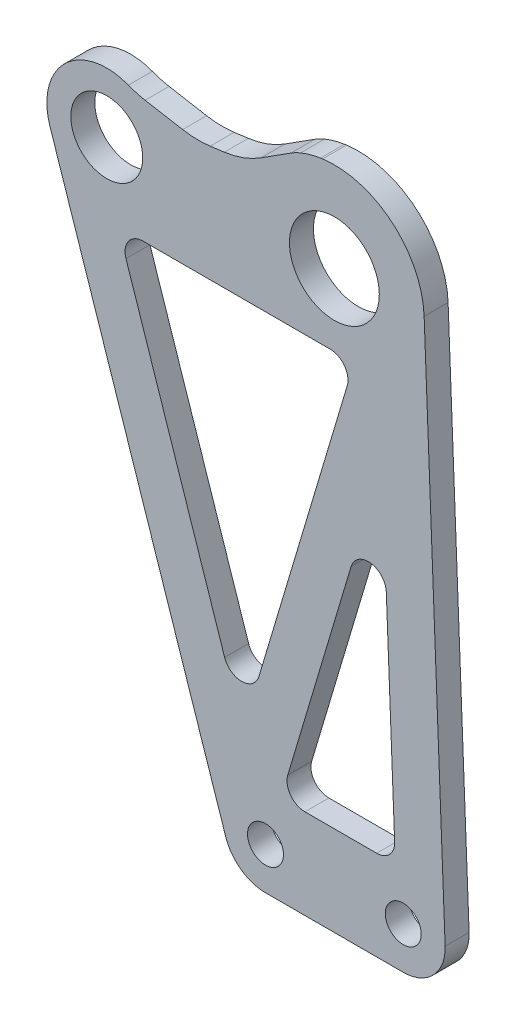
ISO-10303-21;
HEADER;
FILE_DESCRIPTION(('STEP AP214'),'2;1');
FILE_NAME('part.step','',(''),(''),'','','');
FILE_SCHEMA(('AUTOMOTIVE_DESIGN { 1 0 10303 214 1 1 1 1 }'));
ENDSEC;
DATA;
#1=APPLICATION_CONTEXT('core data for automotive mechanical design processes');
#2=APPLICATION_PROTOCOL_DEFINITION('international standard','automotive_design',2000,#1);
#3=PRODUCT_CONTEXT('',#1,'mechanical');
#4=PRODUCT('Part','Part','',(#3));
#5=PRODUCT_RELATED_PRODUCT_CATEGORY('part','',(#4));
#6=PRODUCT_DEFINITION_FORMATION('','',#4);
#7=PRODUCT_DEFINITION_CONTEXT('part definition',#1,'design');
#8=PRODUCT_DEFINITION('design','',#6,#7);
#9=PRODUCT_DEFINITION_SHAPE('','',#8);
#10=(LENGTH_UNIT() NAMED_UNIT(*) SI_UNIT(.MILLI.,.METRE.));
#11=(NAMED_UNIT(*) PLANE_ANGLE_UNIT() SI_UNIT($,.RADIAN.));
#12=(NAMED_UNIT(*) SI_UNIT($,.STERADIAN.) SOLID_ANGLE_UNIT());
#13=UNCERTAINTY_MEASURE_WITH_UNIT(LENGTH_MEASURE(1.E-05),#10,'distance_accuracy_value','');
#14=(GEOMETRIC_REPRESENTATION_CONTEXT(3) GLOBAL_UNCERTAINTY_ASSIGNED_CONTEXT((#13)) GLOBAL_UNIT_ASSIGNED_CONTEXT((#10,
#11,#12)) REPRESENTATION_CONTEXT('',''));
#15=CARTESIAN_POINT('',(0.,0.,0.));
#16=DIRECTION('',(0.,0.,1.));
#17=DIRECTION('',(1.,0.,0.));
#18=AXIS2_PLACEMENT_3D('',#15,#16,#17);
#19=CARTESIAN_POINT('',(-11.5,0.,4.));
#20=DIRECTION('',(0.,0.,1.));
#21=DIRECTION('',(1.,0.,0.));
#22=AXIS2_PLACEMENT_3D('',#19,#20,#21);
#23=PLANE('',#22);
#24=CARTESIAN_POINT('',(0.,89.,4.));
#25=DIRECTION('',(0.,0.,-1.));
#26=DIRECTION('',(1.,0.,0.));
#27=AXIS2_PLACEMENT_3D('',#24,#25,#26);
#28=CIRCLE('',#27,15.0037978079195);
#29=CARTESIAN_POINT('',(-5.64922242854934,102.899648722673,4.));
#30=VERTEX_POINT('',#29);
#31=CARTESIAN_POINT('',(-2.30831216147038,103.825169261298,4.));
#32=VERTEX_POINT('',#31);
#33=EDGE_CURVE('E242',#30,#32,#28,.T.);
#34=ORIENTED_EDGE('',*,*,#33,.F.);
#35=CARTESIAN_POINT('',(-1.88402744200567,93.6355617890726,4.));
#36=DIRECTION('',(0.,0.,1.));
#37=DIRECTION('',(1.,0.,0.));
#38=AXIS2_PLACEMENT_3D('',#35,#36,#37);
#39=CIRCLE('',#38,10.);
#40=CARTESIAN_POINT('',(-7.2590241365421,102.06820138375,4.));
#41=VERTEX_POINT('',#40);
#42=EDGE_CURVE('E358',#30,#41,#39,.T.);
#43=ORIENTED_EDGE('',*,*,#42,.T.);
#44=DIRECTION('',(-0.843263959467748,-0.537499669453644,0.));
#45=VECTOR('',#44,1.);
#46=CARTESIAN_POINT('',(-6.69836822430438,102.425565604196,4.));
#47=LINE('',#46,#45);
#48=CARTESIAN_POINT('',(-12.2752986193332,98.8708088637486,4.));
#49=VERTEX_POINT('',#48);
#50=EDGE_CURVE('E324',#41,#49,#47,.T.);
#51=ORIENTED_EDGE('',*,*,#50,.T.);
#52=CARTESIAN_POINT('',(-20.3377936611379,111.519768255765,4.));
#53=DIRECTION('',(0.,0.,1.));
#54=DIRECTION('',(1.,0.,0.));
#55=AXIS2_PLACEMENT_3D('',#52,#53,#54);
#56=CIRCLE('',#55,15.);
#57=CARTESIAN_POINT('',(-18.3641094506116,96.6501828332616,4.));
#58=VERTEX_POINT('',#57);
#59=EDGE_CURVE('E355',#49,#58,#56,.F.);
#60=ORIENTED_EDGE('',*,*,#59,.T.);
#61=DIRECTION('',(0.991305694833545,0.13157894736842,0.));
#62=VECTOR('',#61,1.);
#63=CARTESIAN_POINT('',(-30.0729355904218,95.0960355844104,4.));
#64=LINE('',#63,#62);
#65=CARTESIAN_POINT('',(-20.7373696980854,96.3351729560649,4.));
#66=VERTEX_POINT('',#65);
#67=EDGE_CURVE('E252',#66,#58,#64,.T.);
#68=ORIENTED_EDGE('',*,*,#67,.F.);
#69=CARTESIAN_POINT('',(-22.7110539086117,111.204758378568,4.));
#70=DIRECTION('',(0.,0.,1.));
#71=DIRECTION('',(1.,0.,0.));
#72=AXIS2_PLACEMENT_3D('',#69,#70,#71);
#73=CIRCLE('',#72,15.);
#74=CARTESIAN_POINT('',(-25.3278901931515,96.4347831632904,4.));
#75=VERTEX_POINT('',#74);
#76=EDGE_CURVE('E349',#66,#75,#73,.F.);
#77=ORIENTED_EDGE('',*,*,#76,.T.);
#78=DIRECTION('',(0.984665014351843,-0.174455752302655,0.));
#79=VECTOR('',#78,1.);
#80=CARTESIAN_POINT('',(-23.0403436682235,96.0294923850897,4.));
#81=LINE('',#80,#79);
#82=CARTESIAN_POINT('',(-31.593804964792,97.5449321575353,4.));
#83=VERTEX_POINT('',#82);
#84=EDGE_CURVE('E318',#75,#83,#81,.F.);
#85=ORIENTED_EDGE('',*,*,#84,.T.);
#86=CARTESIAN_POINT('',(-28.9769686802522,112.314907372813,4.));
#87=DIRECTION('',(0.,0.,1.));
#88=DIRECTION('',(1.,0.,0.));
#89=AXIS2_PLACEMENT_3D('',#86,#87,#88);
#90=CIRCLE('',#89,15.);
#91=CARTESIAN_POINT('',(-34.3907874721009,98.3259629491252,4.));
#92=VERTEX_POINT('',#91);
#93=EDGE_CURVE('E347',#83,#92,#90,.F.);
#94=ORIENTED_EDGE('',*,*,#93,.T.);
#95=CARTESIAN_POINT('',(-38.,89.,4.));
#96=DIRECTION('',(0.,0.,1.));
#97=DIRECTION('',(1.,0.,0.));
#98=AXIS2_PLACEMENT_3D('',#95,#96,#97);
#99=CIRCLE('',#98,10.);
#100=CARTESIAN_POINT('',(-47.4869748371983,85.8381479417331,4.));
#101=VERTEX_POINT('',#100);
#102=EDGE_CURVE('E268',#92,#101,#99,.T.);
#103=ORIENTED_EDGE('',*,*,#102,.T.);
#104=DIRECTION('',(0.31618520582669,-0.948697483719828,0.));
#105=VECTOR('',#104,1.);
#106=CARTESIAN_POINT('',(-47.4869748371983,85.8381479417331,4.));
#107=LINE('',#106,#105);
#108=CARTESIAN_POINT('',(-18.1408823860388,-2.21329644078684,4.));
#109=VERTEX_POINT('',#108);
#110=EDGE_CURVE('E270',#101,#109,#107,.T.);
#111=ORIENTED_EDGE('',*,*,#110,.T.);
#112=CARTESIAN_POINT('',(-11.5,0.,4.));
#113=DIRECTION('',(0.,0.,1.));
#114=DIRECTION('',(1.,0.,0.));
#115=AXIS2_PLACEMENT_3D('',#112,#113,#114);
#116=CIRCLE('',#115,7.00000000000001);
#117=CARTESIAN_POINT('',(-11.5,-7.,4.));
#118=VERTEX_POINT('',#117);
#119=EDGE_CURVE('E295',#109,#118,#116,.T.);
#120=ORIENTED_EDGE('',*,*,#119,.T.);
#121=DIRECTION('',(1.,0.,0.));
#122=VECTOR('',#121,1.);
#123=CARTESIAN_POINT('',(-11.5,-7.,4.));
#124=LINE('',#123,#122);
#125=CARTESIAN_POINT('',(11.5,-7.,4.));
#126=VERTEX_POINT('',#125);
#127=EDGE_CURVE('E501',#118,#126,#124,.T.);
#128=ORIENTED_EDGE('',*,*,#127,.T.);
#129=CARTESIAN_POINT('',(11.5,0.,4.));
#130=DIRECTION('',(0.,0.,1.));
#131=DIRECTION('',(1.,0.,0.));
#132=AXIS2_PLACEMENT_3D('',#129,#130,#131);
#133=CIRCLE('',#132,7.);
#134=CARTESIAN_POINT('',(18.4946124419453,0.274584753734508,4.));
#135=VERTEX_POINT('',#134);
#136=EDGE_CURVE('E503',#126,#135,#133,.T.);
#137=ORIENTED_EDGE('',*,*,#136,.T.);
#138=DIRECTION('',(-0.0392263933906444,0.999230348849334,0.));
#139=VECTOR('',#138,1.);
#140=CARTESIAN_POINT('',(14.98845523274,89.5883959008597,4.));
#141=LINE('',#140,#139);
#142=CARTESIAN_POINT('',(14.98845523274,89.5883959008597,4.));
#143=VERTEX_POINT('',#142);
#144=EDGE_CURVE('E272',#135,#143,#141,.T.);
#145=ORIENTED_EDGE('',*,*,#144,.T.);
#146=CARTESIAN_POINT('',(0.,89.,4.));
#147=DIRECTION('',(0.,0.,1.));
#148=DIRECTION('',(1.,0.,0.));
#149=AXIS2_PLACEMENT_3D('',#146,#147,#148);
#150=CIRCLE('',#149,15.);
#151=CARTESIAN_POINT('',(-1.97368421052631,103.869585422503,4.));
#152=VERTEX_POINT('',#151);
#153=EDGE_CURVE('E266',#143,#152,#150,.T.);
#154=ORIENTED_EDGE('',*,*,#153,.T.);
#155=DIRECTION('',(-0.991305694833545,-0.131578947368421,0.));
#156=VECTOR('',#155,1.);
#157=CARTESIAN_POINT('',(-39.3157894736842,98.9130569483355,4.));
#158=LINE('',#157,#156);
#159=EDGE_CURVE('E259',#152,#32,#158,.T.);
#160=ORIENTED_EDGE('',*,*,#159,.T.);
#161=EDGE_LOOP('',(#34,#43,#51,#60,#68,#77,#85,#94,#103,#111,#120,#128,#137,#145,#154,#160));
#162=FACE_BOUND('',#161,.T.);
#163=CARTESIAN_POINT('',(0.,89.,4.));
#164=DIRECTION('',(0.,0.,1.));
#165=DIRECTION('',(1.,0.,0.));
#166=AXIS2_PLACEMENT_3D('',#163,#164,#165);
#167=CIRCLE('',#166,7.5);
#168=CARTESIAN_POINT('',(7.5,89.,4.));
#169=VERTEX_POINT('',#168);
#170=EDGE_CURVE('E483',#169,#169,#167,.T.);
#171=ORIENTED_EDGE('',*,*,#170,.F.);
#172=EDGE_LOOP('',(#171));
#173=FACE_BOUND('',#172,.T.);
#174=CARTESIAN_POINT('',(-11.5,0.,4.));
#175=DIRECTION('',(0.,0.,1.));
#176=DIRECTION('',(1.,0.,0.));
#177=AXIS2_PLACEMENT_3D('',#174,#175,#176);
#178=CIRCLE('',#177,3.);
#179=CARTESIAN_POINT('',(-8.5,0.,4.));
#180=VERTEX_POINT('',#179);
#181=EDGE_CURVE('E282',#180,#180,#178,.T.);
#182=ORIENTED_EDGE('',*,*,#181,.F.);
#183=EDGE_LOOP('',(#182));
#184=FACE_BOUND('',#183,.T.);
#185=CARTESIAN_POINT('',(11.5,0.,4.));
#186=DIRECTION('',(0.,0.,1.));
#187=DIRECTION('',(1.,0.,0.));
#188=AXIS2_PLACEMENT_3D('',#185,#186,#187);
#189=CIRCLE('',#188,3.);
#190=CARTESIAN_POINT('',(14.5,0.,4.));
#191=VERTEX_POINT('',#190);
#192=EDGE_CURVE('E489',#191,#191,#189,.T.);
#193=ORIENTED_EDGE('',*,*,#192,.F.);
#194=EDGE_LOOP('',(#193));
#195=FACE_BOUND('',#194,.T.);
#196=CARTESIAN_POINT('',(-38.,89.,4.));
#197=DIRECTION('',(0.,0.,1.));
#198=DIRECTION('',(1.,0.,0.));
#199=AXIS2_PLACEMENT_3D('',#196,#197,#198);
#200=CIRCLE('',#199,6.);
#201=CARTESIAN_POINT('',(-32.,89.,4.));
#202=VERTEX_POINT('',#201);
#203=EDGE_CURVE('E477',#202,#202,#200,.T.);
#204=ORIENTED_EDGE('',*,*,#203,.F.);
#205=EDGE_LOOP('',(#204));
#206=FACE_BOUND('',#205,.T.);
#207=DIRECTION('',(-0.31618520582669,0.948697483719828,0.));
#208=VECTOR('',#207,1.);
#209=CARTESIAN_POINT('',(-9.40161204586802,-3.13340204948131,4.));
#210=LINE('',#209,#208);
#211=CARTESIAN_POINT('',(-18.3187912197339,23.6221364394461,4.));
#212=VERTEX_POINT('',#211);
#213=CARTESIAN_POINT('',(-34.7927633489435,73.0514443825199,4.));
#214=VERTEX_POINT('',#213);
#215=EDGE_CURVE('E253',#212,#214,#210,.T.);
#216=ORIENTED_EDGE('',*,*,#215,.T.);
#217=CARTESIAN_POINT('',(-31.946670897784,74.,4.));
#218=DIRECTION('',(0.,0.,1.));
#219=DIRECTION('',(1.,0.,0.));
#220=AXIS2_PLACEMENT_3D('',#217,#218,#219);
#221=CIRCLE('',#220,3.);
#222=CARTESIAN_POINT('',(-31.946670897784,77.,4.));
#223=VERTEX_POINT('',#222);
#224=EDGE_CURVE('E78',#214,#223,#221,.F.);
#225=ORIENTED_EDGE('',*,*,#224,.T.);
#226=DIRECTION('',(1.,0.,0.));
#227=VECTOR('',#226,1.);
#228=CARTESIAN_POINT('',(0.,77.,4.));
#229=LINE('',#228,#227);
#230=CARTESIAN_POINT('',(-0.723665157099515,77.,4.));
#231=VERTEX_POINT('',#230);
#232=EDGE_CURVE('E470',#223,#231,#229,.T.);
#233=ORIENTED_EDGE('',*,*,#232,.T.);
#234=CARTESIAN_POINT('',(-0.723665157099515,74.,4.));
#235=DIRECTION('',(0.,0.,1.));
#236=DIRECTION('',(1.,0.,0.));
#237=AXIS2_PLACEMENT_3D('',#234,#235,#236);
#238=CIRCLE('',#237,3.);
#239=CARTESIAN_POINT('',(2.15108724799843,73.142212958023,4.));
#240=VERTEX_POINT('',#239);
#241=EDGE_CURVE('E70',#231,#240,#238,.F.);
#242=ORIENTED_EDGE('',*,*,#241,.T.);
#243=DIRECTION('',(-0.285929013992323,-0.958250801699314,0.));
#244=VECTOR('',#243,1.);
#245=CARTESIAN_POINT('',(-18.0651355265179,5.39039088678559,4.));
#246=LINE('',#245,#244);
#247=CARTESIAN_POINT('',(-12.5979463634765,23.7129050149492,4.));
#248=VERTEX_POINT('',#247);
#249=EDGE_CURVE('E467',#240,#248,#246,.T.);
#250=ORIENTED_EDGE('',*,*,#249,.T.);
#251=CARTESIAN_POINT('',(-15.4726987685745,24.5706920569262,4.));
#252=DIRECTION('',(0.,0.,1.));
#253=DIRECTION('',(1.,0.,0.));
#254=AXIS2_PLACEMENT_3D('',#251,#252,#253);
#255=CIRCLE('',#254,3.);
#256=EDGE_CURVE('E419',#248,#212,#255,.F.);
#257=ORIENTED_EDGE('',*,*,#256,.T.);
#258=EDGE_LOOP('',(#216,#225,#233,#242,#250,#257));
#259=FACE_BOUND('',#258,.T.);
#260=DIRECTION('',(-0.285929013992323,-0.958250801699314,0.));
#261=VECTOR('',#260,1.);
#262=CARTESIAN_POINT('',(-10.3991291129234,3.102958774847,4.));
#263=LINE('',#262,#261);
#264=CARTESIAN_POINT('',(2.79780120994223,47.3306112445454,4.));
#265=VERTEX_POINT('',#264);
#266=CARTESIAN_POINT('',(-7.78680735994036,11.857787041977,4.));
#267=VERTEX_POINT('',#266);
#268=EDGE_CURVE('E432',#265,#267,#263,.T.);
#269=ORIENTED_EDGE('',*,*,#268,.F.);
#270=CARTESIAN_POINT('',(5.67255361504017,46.4728242025685,4.));
#271=DIRECTION('',(0.,0.,1.));
#272=DIRECTION('',(1.,0.,0.));
#273=AXIS2_PLACEMENT_3D('',#270,#271,#272);
#274=CIRCLE('',#273,3.);
#275=CARTESIAN_POINT('',(8.67024466158817,46.5905033827404,4.));
#276=VERTEX_POINT('',#275);
#277=EDGE_CURVE('E415',#265,#276,#274,.F.);
#278=ORIENTED_EDGE('',*,*,#277,.T.);
#279=DIRECTION('',(0.0392263933906444,-0.999230348849334,0.));
#280=VECTOR('',#279,1.);
#281=CARTESIAN_POINT('',(10.4830744868586,0.411529938255457,4.));
#282=LINE('',#281,#280);
#283=CARTESIAN_POINT('',(10.062787390549,11.1176791801719,4.));
#284=VERTEX_POINT('',#283);
#285=EDGE_CURVE('E442',#276,#284,#282,.T.);
#286=ORIENTED_EDGE('',*,*,#285,.T.);
#287=CARTESIAN_POINT('',(7.06509634400099,11.,4.));
#288=DIRECTION('',(0.,0.,1.));
#289=DIRECTION('',(1.,0.,0.));
#290=AXIS2_PLACEMENT_3D('',#287,#288,#289);
#291=CIRCLE('',#290,3.);
#292=CARTESIAN_POINT('',(7.06509634400099,8.,4.));
#293=VERTEX_POINT('',#292);
#294=EDGE_CURVE('E411',#284,#293,#291,.F.);
#295=ORIENTED_EDGE('',*,*,#294,.T.);
#296=DIRECTION('',(-1.,0.,0.));
#297=VECTOR('',#296,1.);
#298=CARTESIAN_POINT('',(0.,8.,4.));
#299=LINE('',#298,#297);
#300=CARTESIAN_POINT('',(-4.91205495484242,8.,4.));
#301=VERTEX_POINT('',#300);
#302=EDGE_CURVE('E434',#293,#301,#299,.T.);
#303=ORIENTED_EDGE('',*,*,#302,.T.);
#304=CARTESIAN_POINT('',(-4.91205495484242,11.,4.));
#305=DIRECTION('',(0.,0.,1.));
#306=DIRECTION('',(1.,0.,0.));
#307=AXIS2_PLACEMENT_3D('',#304,#305,#306);
#308=CIRCLE('',#307,3.);
#309=EDGE_CURVE('E63',#301,#267,#308,.F.);
#310=ORIENTED_EDGE('',*,*,#309,.T.);
#311=EDGE_LOOP('',(#269,#278,#286,#295,#303,#310));
#312=FACE_BOUND('',#311,.T.);
#313=ADVANCED_FACE('F55',(#162,#173,#184,#195,#206,#259,#312),#23,.T.);
#314=CARTESIAN_POINT('',(-11.5,0.,0.));
#315=DIRECTION('',(0.,0.,1.));
#316=DIRECTION('',(1.,0.,0.));
#317=AXIS2_PLACEMENT_3D('',#314,#315,#316);
#318=PLANE('',#317);
#319=DIRECTION('',(-0.285929013992323,-0.958250801699314,0.));
#320=VECTOR('',#319,1.);
#321=CARTESIAN_POINT('',(-19.0053226385081,2.23948625758235,0.));
#322=LINE('',#321,#320);
#323=CARTESIAN_POINT('',(2.15108724799843,73.1422129580231,0.));
#324=VERTEX_POINT('',#323);
#325=CARTESIAN_POINT('',(-12.5979463634765,23.7129050149492,0.));
#326=VERTEX_POINT('',#325);
#327=EDGE_CURVE('E370',#324,#326,#322,.T.);
#328=ORIENTED_EDGE('',*,*,#327,.F.);
#329=CARTESIAN_POINT('',(-0.723665157099515,74.,0.));
#330=DIRECTION('',(0.,0.,1.));
#331=DIRECTION('',(1.,0.,0.));
#332=AXIS2_PLACEMENT_3D('',#329,#330,#331);
#333=CIRCLE('',#332,3.);
#334=CARTESIAN_POINT('',(-0.723665157099516,77.,0.));
#335=VERTEX_POINT('',#334);
#336=EDGE_CURVE('E427',#324,#335,#333,.T.);
#337=ORIENTED_EDGE('',*,*,#336,.T.);
#338=DIRECTION('',(1.,0.,0.));
#339=VECTOR('',#338,1.);
#340=CARTESIAN_POINT('',(-11.5,77.,0.));
#341=LINE('',#340,#339);
#342=CARTESIAN_POINT('',(-31.946670897784,77.,0.));
#343=VERTEX_POINT('',#342);
#344=EDGE_CURVE('E364',#343,#335,#341,.T.);
#345=ORIENTED_EDGE('',*,*,#344,.F.);
#346=CARTESIAN_POINT('',(-31.946670897784,74.,0.));
#347=DIRECTION('',(0.,0.,1.));
#348=DIRECTION('',(1.,0.,0.));
#349=AXIS2_PLACEMENT_3D('',#346,#347,#348);
#350=CIRCLE('',#349,3.);
#351=CARTESIAN_POINT('',(-34.7927633489435,73.05144438252,0.));
#352=VERTEX_POINT('',#351);
#353=EDGE_CURVE('E424',#343,#352,#350,.T.);
#354=ORIENTED_EDGE('',*,*,#353,.T.);
#355=DIRECTION('',(-0.31618520582669,0.948697483719828,0.));
#356=VECTOR('',#355,1.);
#357=CARTESIAN_POINT('',(-10.5513025162802,0.316185205826684,0.));
#358=LINE('',#357,#356);
#359=CARTESIAN_POINT('',(-18.3187912197339,23.6221364394461,0.));
#360=VERTEX_POINT('',#359);
#361=EDGE_CURVE('E367',#360,#352,#358,.T.);
#362=ORIENTED_EDGE('',*,*,#361,.F.);
#363=CARTESIAN_POINT('',(-15.4726987685745,24.5706920569262,0.));
#364=DIRECTION('',(0.,0.,1.));
#365=DIRECTION('',(1.,0.,0.));
#366=AXIS2_PLACEMENT_3D('',#363,#364,#365);
#367=CIRCLE('',#366,3.);
#368=EDGE_CURVE('E421',#360,#326,#367,.T.);
#369=ORIENTED_EDGE('',*,*,#368,.T.);
#370=EDGE_LOOP('',(#328,#337,#345,#354,#362,#369));
#371=FACE_BOUND('',#370,.T.);
#372=DIRECTION('',(0.843263959467748,0.537499669453644,0.));
#373=VECTOR('',#372,1.);
#374=CARTESIAN_POINT('',(-56.5375877772598,70.6578566504659,0.));
#375=LINE('',#374,#373);
#376=CARTESIAN_POINT('',(-12.2752986193332,98.8708088637486,0.));
#377=VERTEX_POINT('',#376);
#378=CARTESIAN_POINT('',(-7.25902413654209,102.06820138375,0.));
#379=VERTEX_POINT('',#378);
#380=EDGE_CURVE('E326',#377,#379,#375,.T.);
#381=ORIENTED_EDGE('',*,*,#380,.T.);
#382=CARTESIAN_POINT('',(-1.88402744200567,93.6355617890726,0.));
#383=DIRECTION('',(0.,0.,1.));
#384=DIRECTION('',(1.,0.,0.));
#385=AXIS2_PLACEMENT_3D('',#382,#383,#384);
#386=CIRCLE('',#385,10.);
#387=CARTESIAN_POINT('',(-5.64922242854934,102.899648722673,0.));
#388=VERTEX_POINT('',#387);
#389=EDGE_CURVE('E362',#379,#388,#386,.F.);
#390=ORIENTED_EDGE('',*,*,#389,.T.);
#391=CARTESIAN_POINT('',(0.,89.,0.));
#392=DIRECTION('',(0.,0.,1.));
#393=DIRECTION('',(1.,0.,0.));
#394=AXIS2_PLACEMENT_3D('',#391,#392,#393);
#395=CIRCLE('',#394,15.0037978079195);
#396=CARTESIAN_POINT('',(-2.30831216147038,103.825169261298,0.));
#397=VERTEX_POINT('',#396);
#398=EDGE_CURVE('E262',#388,#397,#395,.F.);
#399=ORIENTED_EDGE('',*,*,#398,.T.);
#400=DIRECTION('',(-0.991305694833545,-0.131578947368421,0.));
#401=VECTOR('',#400,1.);
#402=CARTESIAN_POINT('',(-39.3157894736842,98.9130569483355,0.));
#403=LINE('',#402,#401);
#404=CARTESIAN_POINT('',(-1.97368421052631,103.869585422503,0.));
#405=VERTEX_POINT('',#404);
#406=EDGE_CURVE('E261',#405,#397,#403,.T.);
#407=ORIENTED_EDGE('',*,*,#406,.F.);
#408=CARTESIAN_POINT('',(0.,89.,0.));
#409=DIRECTION('',(0.,0.,1.));
#410=DIRECTION('',(1.,0.,0.));
#411=AXIS2_PLACEMENT_3D('',#408,#409,#410);
#412=CIRCLE('',#411,15.);
#413=CARTESIAN_POINT('',(14.98845523274,89.5883959008597,0.));
#414=VERTEX_POINT('',#413);
#415=EDGE_CURVE('E288',#414,#405,#412,.T.);
#416=ORIENTED_EDGE('',*,*,#415,.F.);
#417=DIRECTION('',(-0.0392263933906444,0.999230348849334,0.));
#418=VECTOR('',#417,1.);
#419=CARTESIAN_POINT('',(14.98845523274,89.5883959008597,0.));
#420=LINE('',#419,#418);
#421=CARTESIAN_POINT('',(18.4946124419453,0.274584753734508,0.));
#422=VERTEX_POINT('',#421);
#423=EDGE_CURVE('E286',#422,#414,#420,.T.);
#424=ORIENTED_EDGE('',*,*,#423,.F.);
#425=CARTESIAN_POINT('',(11.5,0.,0.));
#426=DIRECTION('',(0.,0.,1.));
#427=DIRECTION('',(1.,0.,0.));
#428=AXIS2_PLACEMENT_3D('',#425,#426,#427);
#429=CIRCLE('',#428,7.);
#430=CARTESIAN_POINT('',(11.5,-7.,0.));
#431=VERTEX_POINT('',#430);
#432=EDGE_CURVE('E284',#431,#422,#429,.T.);
#433=ORIENTED_EDGE('',*,*,#432,.F.);
#434=DIRECTION('',(1.,0.,0.));
#435=VECTOR('',#434,1.);
#436=CARTESIAN_POINT('',(-11.5,-7.,0.));
#437=LINE('',#436,#435);
#438=CARTESIAN_POINT('',(-11.5,-7.,0.));
#439=VERTEX_POINT('',#438);
#440=EDGE_CURVE('E281',#439,#431,#437,.T.);
#441=ORIENTED_EDGE('',*,*,#440,.F.);
#442=CARTESIAN_POINT('',(-11.5,0.,0.));
#443=DIRECTION('',(0.,0.,1.));
#444=DIRECTION('',(1.,0.,0.));
#445=AXIS2_PLACEMENT_3D('',#442,#443,#444);
#446=CIRCLE('',#445,7.00000000000001);
#447=CARTESIAN_POINT('',(-18.1408823860388,-2.21329644078684,0.));
#448=VERTEX_POINT('',#447);
#449=EDGE_CURVE('E278',#448,#439,#446,.T.);
#450=ORIENTED_EDGE('',*,*,#449,.F.);
#451=DIRECTION('',(0.31618520582669,-0.948697483719828,0.));
#452=VECTOR('',#451,1.);
#453=CARTESIAN_POINT('',(-47.4869748371983,85.8381479417331,0.));
#454=LINE('',#453,#452);
#455=CARTESIAN_POINT('',(-47.4869748371983,85.8381479417331,0.));
#456=VERTEX_POINT('',#455);
#457=EDGE_CURVE('E293',#456,#448,#454,.T.);
#458=ORIENTED_EDGE('',*,*,#457,.F.);
#459=CARTESIAN_POINT('',(-38.,89.,0.));
#460=DIRECTION('',(0.,0.,1.));
#461=DIRECTION('',(1.,0.,0.));
#462=AXIS2_PLACEMENT_3D('',#459,#460,#461);
#463=CIRCLE('',#462,10.);
#464=CARTESIAN_POINT('',(-34.3907874721009,98.3259629491252,0.));
#465=VERTEX_POINT('',#464);
#466=EDGE_CURVE('E291',#465,#456,#463,.T.);
#467=ORIENTED_EDGE('',*,*,#466,.F.);
#468=CARTESIAN_POINT('',(-28.9769686802522,112.314907372813,0.));
#469=DIRECTION('',(0.,0.,1.));
#470=DIRECTION('',(1.,0.,0.));
#471=AXIS2_PLACEMENT_3D('',#468,#469,#470);
#472=CIRCLE('',#471,15.);
#473=CARTESIAN_POINT('',(-31.593804964792,97.5449321575354,0.));
#474=VERTEX_POINT('',#473);
#475=EDGE_CURVE('E345',#465,#474,#472,.T.);
#476=ORIENTED_EDGE('',*,*,#475,.T.);
#477=DIRECTION('',(-0.984665014351843,0.174455752302655,0.));
#478=VECTOR('',#477,1.);
#479=CARTESIAN_POINT('',(4.64476373581114,91.1244473501243,0.));
#480=LINE('',#479,#478);
#481=CARTESIAN_POINT('',(-25.3278901931515,96.4347831632904,0.));
#482=VERTEX_POINT('',#481);
#483=EDGE_CURVE('E321',#474,#482,#480,.F.);
#484=ORIENTED_EDGE('',*,*,#483,.T.);
#485=CARTESIAN_POINT('',(-22.7110539086117,111.204758378568,0.));
#486=DIRECTION('',(0.,0.,1.));
#487=DIRECTION('',(1.,0.,0.));
#488=AXIS2_PLACEMENT_3D('',#485,#486,#487);
#489=CIRCLE('',#488,15.);
#490=CARTESIAN_POINT('',(-20.7373696980854,96.3351729560649,0.));
#491=VERTEX_POINT('',#490);
#492=EDGE_CURVE('E351',#482,#491,#489,.T.);
#493=ORIENTED_EDGE('',*,*,#492,.T.);
#494=DIRECTION('',(0.991305694833546,0.13157894736842,0.));
#495=VECTOR('',#494,1.);
#496=CARTESIAN_POINT('',(-24.2254011770327,95.8721961843387,0.));
#497=LINE('',#496,#495);
#498=CARTESIAN_POINT('',(-18.3641094506116,96.6501828332616,0.));
#499=VERTEX_POINT('',#498);
#500=EDGE_CURVE('E315',#491,#499,#497,.T.);
#501=ORIENTED_EDGE('',*,*,#500,.T.);
#502=CARTESIAN_POINT('',(-20.3377936611379,111.519768255765,0.));
#503=DIRECTION('',(0.,0.,1.));
#504=DIRECTION('',(1.,0.,0.));
#505=AXIS2_PLACEMENT_3D('',#502,#503,#504);
#506=CIRCLE('',#505,15.);
#507=EDGE_CURVE('E353',#499,#377,#506,.T.);
#508=ORIENTED_EDGE('',*,*,#507,.T.);
#509=EDGE_LOOP('',(#381,#390,#399,#407,#416,#424,#433,#441,#450,#458,#467,#476,#484,#493,#501,#508));
#510=FACE_BOUND('',#509,.T.);
#511=CARTESIAN_POINT('',(-11.5,0.,0.));
#512=DIRECTION('',(0.,0.,1.));
#513=DIRECTION('',(1.,0.,0.));
#514=AXIS2_PLACEMENT_3D('',#511,#512,#513);
#515=CIRCLE('',#514,3.);
#516=CARTESIAN_POINT('',(-8.5,0.,0.));
#517=VERTEX_POINT('',#516);
#518=EDGE_CURVE('E492',#517,#517,#515,.T.);
#519=ORIENTED_EDGE('',*,*,#518,.T.);
#520=EDGE_LOOP('',(#519));
#521=FACE_BOUND('',#520,.T.);
#522=CARTESIAN_POINT('',(11.5,0.,0.));
#523=DIRECTION('',(0.,0.,1.));
#524=DIRECTION('',(1.,0.,0.));
#525=AXIS2_PLACEMENT_3D('',#522,#523,#524);
#526=CIRCLE('',#525,3.);
#527=CARTESIAN_POINT('',(14.5,0.,0.));
#528=VERTEX_POINT('',#527);
#529=EDGE_CURVE('E486',#528,#528,#526,.T.);
#530=ORIENTED_EDGE('',*,*,#529,.T.);
#531=EDGE_LOOP('',(#530));
#532=FACE_BOUND('',#531,.T.);
#533=CARTESIAN_POINT('',(0.,89.,0.));
#534=DIRECTION('',(0.,0.,1.));
#535=DIRECTION('',(1.,0.,0.));
#536=AXIS2_PLACEMENT_3D('',#533,#534,#535);
#537=CIRCLE('',#536,7.5);
#538=CARTESIAN_POINT('',(7.5,89.,0.));
#539=VERTEX_POINT('',#538);
#540=EDGE_CURVE('E480',#539,#539,#537,.T.);
#541=ORIENTED_EDGE('',*,*,#540,.T.);
#542=EDGE_LOOP('',(#541));
#543=FACE_BOUND('',#542,.T.);
#544=CARTESIAN_POINT('',(-38.,89.,0.));
#545=DIRECTION('',(0.,0.,1.));
#546=DIRECTION('',(1.,0.,0.));
#547=AXIS2_PLACEMENT_3D('',#544,#545,#546);
#548=CIRCLE('',#547,6.);
#549=CARTESIAN_POINT('',(-32.,89.,0.));
#550=VERTEX_POINT('',#549);
#551=EDGE_CURVE('E476',#550,#550,#548,.T.);
#552=ORIENTED_EDGE('',*,*,#551,.T.);
#553=EDGE_LOOP('',(#552));
#554=FACE_BOUND('',#553,.T.);
#555=DIRECTION('',(0.0392263933906444,-0.999230348849334,0.));
#556=VECTOR('',#555,1.);
#557=CARTESIAN_POINT('',(10.4653793225666,0.862286269901558,0.));
#558=LINE('',#557,#556);
#559=CARTESIAN_POINT('',(8.67024466158817,46.5905033827404,0.));
#560=VERTEX_POINT('',#559);
#561=CARTESIAN_POINT('',(10.062787390549,11.1176791801719,0.));
#562=VERTEX_POINT('',#561);
#563=EDGE_CURVE('E379',#560,#562,#558,.T.);
#564=ORIENTED_EDGE('',*,*,#563,.F.);
#565=CARTESIAN_POINT('',(5.67255361504017,46.4728242025685,0.));
#566=DIRECTION('',(0.,0.,1.));
#567=DIRECTION('',(1.,0.,0.));
#568=AXIS2_PLACEMENT_3D('',#565,#566,#567);
#569=CIRCLE('',#568,3.);
#570=CARTESIAN_POINT('',(2.79780120994223,47.3306112445454,0.));
#571=VERTEX_POINT('',#570);
#572=EDGE_CURVE('E417',#560,#571,#569,.T.);
#573=ORIENTED_EDGE('',*,*,#572,.T.);
#574=DIRECTION('',(-0.285929013992323,-0.958250801699314,0.));
#575=VECTOR('',#574,1.);
#576=CARTESIAN_POINT('',(-11.3393162249136,-0.0479458543562355,0.));
#577=LINE('',#576,#575);
#578=CARTESIAN_POINT('',(-7.78680735994036,11.857787041977,0.));
#579=VERTEX_POINT('',#578);
#580=EDGE_CURVE('E373',#571,#579,#577,.T.);
#581=ORIENTED_EDGE('',*,*,#580,.T.);
#582=CARTESIAN_POINT('',(-4.91205495484242,11.,0.));
#583=DIRECTION('',(0.,0.,1.));
#584=DIRECTION('',(1.,0.,0.));
#585=AXIS2_PLACEMENT_3D('',#582,#583,#584);
#586=CIRCLE('',#585,3.);
#587=CARTESIAN_POINT('',(-4.91205495484242,8.,0.));
#588=VERTEX_POINT('',#587);
#589=EDGE_CURVE('E12',#579,#588,#586,.T.);
#590=ORIENTED_EDGE('',*,*,#589,.T.);
#591=DIRECTION('',(-1.,0.,0.));
#592=VECTOR('',#591,1.);
#593=CARTESIAN_POINT('',(-11.5,8.,0.));
#594=LINE('',#593,#592);
#595=CARTESIAN_POINT('',(7.06509634400099,8.,0.));
#596=VERTEX_POINT('',#595);
#597=EDGE_CURVE('E376',#596,#588,#594,.T.);
#598=ORIENTED_EDGE('',*,*,#597,.F.);
#599=CARTESIAN_POINT('',(7.06509634400099,11.,0.));
#600=DIRECTION('',(0.,0.,1.));
#601=DIRECTION('',(1.,0.,0.));
#602=AXIS2_PLACEMENT_3D('',#599,#600,#601);
#603=CIRCLE('',#602,3.);
#604=EDGE_CURVE('E413',#596,#562,#603,.T.);
#605=ORIENTED_EDGE('',*,*,#604,.T.);
#606=EDGE_LOOP('',(#564,#573,#581,#590,#598,#605));
#607=FACE_BOUND('',#606,.T.);
#608=ADVANCED_FACE('F448',(#371,#510,#521,#532,#543,#554,#607),#318,.F.);
#609=CARTESIAN_POINT('',(-11.5,0.,4.));
#610=DIRECTION('',(0.,0.,-1.));
#611=DIRECTION('',(-1.,0.,0.));
#612=AXIS2_PLACEMENT_3D('',#609,#610,#611);
#613=CYLINDRICAL_SURFACE('',#612,7.00000000000001);
#614=ORIENTED_EDGE('',*,*,#449,.T.);
#615=DIRECTION('',(0.,0.,-1.));
#616=VECTOR('',#615,1.);
#617=CARTESIAN_POINT('',(-11.5,-7.,4.));
#618=LINE('',#617,#616);
#619=EDGE_CURVE('E312',#118,#439,#618,.T.);
#620=ORIENTED_EDGE('',*,*,#619,.F.);
#621=ORIENTED_EDGE('',*,*,#119,.F.);
#622=DIRECTION('',(0.,0.,-1.));
#623=VECTOR('',#622,1.);
#624=CARTESIAN_POINT('',(-18.1408823860388,-2.21329644078684,4.));
#625=LINE('',#624,#623);
#626=EDGE_CURVE('E277',#109,#448,#625,.T.);
#627=ORIENTED_EDGE('',*,*,#626,.T.);
#628=EDGE_LOOP('',(#614,#620,#621,#627));
#629=FACE_BOUND('',#628,.T.);
#630=ADVANCED_FACE('F561',(#629),#613,.T.);
#631=CARTESIAN_POINT('',(-11.5,-7.,4.));
#632=DIRECTION('',(0.,1.,0.));
#633=DIRECTION('',(-1.,0.,0.));
#634=AXIS2_PLACEMENT_3D('',#631,#632,#633);
#635=PLANE('',#634);
#636=ORIENTED_EDGE('',*,*,#440,.T.);
#637=DIRECTION('',(0.,0.,-1.));
#638=VECTOR('',#637,1.);
#639=CARTESIAN_POINT('',(11.5,-7.,4.));
#640=LINE('',#639,#638);
#641=EDGE_CURVE('E309',#126,#431,#640,.T.);
#642=ORIENTED_EDGE('',*,*,#641,.F.);
#643=ORIENTED_EDGE('',*,*,#127,.F.);
#644=ORIENTED_EDGE('',*,*,#619,.T.);
#645=EDGE_LOOP('',(#636,#642,#643,#644));
#646=FACE_BOUND('',#645,.T.);
#647=ADVANCED_FACE('F564',(#646),#635,.F.);
#648=CARTESIAN_POINT('',(11.5,0.,4.));
#649=DIRECTION('',(0.,0.,-1.));
#650=DIRECTION('',(-1.,0.,0.));
#651=AXIS2_PLACEMENT_3D('',#648,#649,#650);
#652=CYLINDRICAL_SURFACE('',#651,7.);
#653=ORIENTED_EDGE('',*,*,#432,.T.);
#654=DIRECTION('',(0.,0.,-1.));
#655=VECTOR('',#654,1.);
#656=CARTESIAN_POINT('',(18.4946124419453,0.274584753734508,4.));
#657=LINE('',#656,#655);
#658=EDGE_CURVE('E306',#135,#422,#657,.T.);
#659=ORIENTED_EDGE('',*,*,#658,.F.);
#660=ORIENTED_EDGE('',*,*,#136,.F.);
#661=ORIENTED_EDGE('',*,*,#641,.T.);
#662=EDGE_LOOP('',(#653,#659,#660,#661));
#663=FACE_BOUND('',#662,.T.);
#664=ADVANCED_FACE('F567',(#663),#652,.T.);
#665=CARTESIAN_POINT('',(14.98845523274,89.5883959008597,4.));
#666=DIRECTION('',(-0.999230348849334,-0.0392263933906444,0.));
#667=DIRECTION('',(0.0392263933906444,-0.999230348849334,0.));
#668=AXIS2_PLACEMENT_3D('',#665,#666,#667);
#669=PLANE('',#668);
#670=ORIENTED_EDGE('',*,*,#423,.T.);
#671=DIRECTION('',(0.,0.,-1.));
#672=VECTOR('',#671,1.);
#673=CARTESIAN_POINT('',(14.98845523274,89.5883959008597,4.));
#674=LINE('',#673,#672);
#675=EDGE_CURVE('E303',#143,#414,#674,.T.);
#676=ORIENTED_EDGE('',*,*,#675,.F.);
#677=ORIENTED_EDGE('',*,*,#144,.F.);
#678=ORIENTED_EDGE('',*,*,#658,.T.);
#679=EDGE_LOOP('',(#670,#676,#677,#678));
#680=FACE_BOUND('',#679,.T.);
#681=ADVANCED_FACE('F509',(#680),#669,.F.);
#682=CARTESIAN_POINT('',(0.,89.,4.));
#683=DIRECTION('',(0.,0.,-1.));
#684=DIRECTION('',(-1.,0.,0.));
#685=AXIS2_PLACEMENT_3D('',#682,#683,#684);
#686=CYLINDRICAL_SURFACE('',#685,15.);
#687=ORIENTED_EDGE('',*,*,#415,.T.);
#688=DIRECTION('',(0.,0.,-1.));
#689=VECTOR('',#688,1.);
#690=CARTESIAN_POINT('',(-1.97368421052631,103.869585422503,4.));
#691=LINE('',#690,#689);
#692=EDGE_CURVE('E301',#152,#405,#691,.T.);
#693=ORIENTED_EDGE('',*,*,#692,.F.);
#694=ORIENTED_EDGE('',*,*,#153,.F.);
#695=ORIENTED_EDGE('',*,*,#675,.T.);
#696=EDGE_LOOP('',(#687,#693,#694,#695));
#697=FACE_BOUND('',#696,.T.);
#698=ADVANCED_FACE('F513',(#697),#686,.T.);
#699=CARTESIAN_POINT('',(-39.3157894736842,98.9130569483355,4.));
#700=DIRECTION('',(0.131578947368421,-0.991305694833546,0.));
#701=DIRECTION('',(0.991305694833546,0.131578947368421,0.));
#702=AXIS2_PLACEMENT_3D('',#699,#700,#701);
#703=PLANE('',#702);
#704=ORIENTED_EDGE('',*,*,#406,.T.);
#705=DIRECTION('',(0.,0.,1.));
#706=VECTOR('',#705,1.);
#707=CARTESIAN_POINT('',(-2.30831216147038,103.825169261298,-6.));
#708=LINE('',#707,#706);
#709=EDGE_CURVE('E246',#397,#32,#708,.T.);
#710=ORIENTED_EDGE('',*,*,#709,.T.);
#711=ORIENTED_EDGE('',*,*,#159,.F.);
#712=ORIENTED_EDGE('',*,*,#692,.T.);
#713=EDGE_LOOP('',(#704,#710,#711,#712));
#714=FACE_BOUND('',#713,.T.);
#715=ADVANCED_FACE('F257',(#714),#703,.F.);
#716=CARTESIAN_POINT('',(-38.,89.,4.));
#717=DIRECTION('',(0.,0.,-1.));
#718=DIRECTION('',(-1.,0.,0.));
#719=AXIS2_PLACEMENT_3D('',#716,#717,#718);
#720=CYLINDRICAL_SURFACE('',#719,10.);
#721=ORIENTED_EDGE('',*,*,#102,.F.);
#722=DIRECTION('',(0.,0.,-1.));
#723=VECTOR('',#722,1.);
#724=CARTESIAN_POINT('',(-34.3907874721009,98.3259629491252,4.));
#725=LINE('',#724,#723);
#726=EDGE_CURVE('E329',#92,#465,#725,.T.);
#727=ORIENTED_EDGE('',*,*,#726,.T.);
#728=ORIENTED_EDGE('',*,*,#466,.T.);
#729=DIRECTION('',(0.,0.,-1.));
#730=VECTOR('',#729,1.);
#731=CARTESIAN_POINT('',(-47.4869748371983,85.8381479417331,4.));
#732=LINE('',#731,#730);
#733=EDGE_CURVE('E298',#101,#456,#732,.T.);
#734=ORIENTED_EDGE('',*,*,#733,.F.);
#735=EDGE_LOOP('',(#721,#727,#728,#734));
#736=FACE_BOUND('',#735,.T.);
#737=ADVANCED_FACE('F550',(#736),#720,.T.);
#738=CARTESIAN_POINT('',(-47.4869748371983,85.8381479417331,4.));
#739=DIRECTION('',(0.948697483719828,0.31618520582669,0.));
#740=DIRECTION('',(-0.31618520582669,0.948697483719828,0.));
#741=AXIS2_PLACEMENT_3D('',#738,#739,#740);
#742=PLANE('',#741);
#743=ORIENTED_EDGE('',*,*,#457,.T.);
#744=ORIENTED_EDGE('',*,*,#626,.F.);
#745=ORIENTED_EDGE('',*,*,#110,.F.);
#746=ORIENTED_EDGE('',*,*,#733,.T.);
#747=EDGE_LOOP('',(#743,#744,#745,#746));
#748=FACE_BOUND('',#747,.T.);
#749=ADVANCED_FACE('F556',(#748),#742,.F.);
#750=CARTESIAN_POINT('',(-11.5,0.,4.));
#751=DIRECTION('',(0.,0.,-1.));
#752=DIRECTION('',(-1.,0.,0.));
#753=AXIS2_PLACEMENT_3D('',#750,#751,#752);
#754=CYLINDRICAL_SURFACE('',#753,3.);
#755=ORIENTED_EDGE('',*,*,#181,.T.);
#756=EDGE_LOOP('',(#755));
#757=FACE_BOUND('',#756,.T.);
#758=ORIENTED_EDGE('',*,*,#518,.F.);
#759=EDGE_LOOP('',(#758));
#760=FACE_BOUND('',#759,.T.);
#761=ADVANCED_FACE('F584',(#757,#760),#754,.F.);
#762=CARTESIAN_POINT('',(11.5,0.,4.));
#763=DIRECTION('',(0.,0.,-1.));
#764=DIRECTION('',(-1.,0.,0.));
#765=AXIS2_PLACEMENT_3D('',#762,#763,#764);
#766=CYLINDRICAL_SURFACE('',#765,3.);
#767=ORIENTED_EDGE('',*,*,#192,.T.);
#768=EDGE_LOOP('',(#767));
#769=FACE_BOUND('',#768,.T.);
#770=ORIENTED_EDGE('',*,*,#529,.F.);
#771=EDGE_LOOP('',(#770));
#772=FACE_BOUND('',#771,.T.);
#773=ADVANCED_FACE('F618',(#769,#772),#766,.F.);
#774=CARTESIAN_POINT('',(0.,89.,4.));
#775=DIRECTION('',(0.,0.,-1.));
#776=DIRECTION('',(-1.,0.,0.));
#777=AXIS2_PLACEMENT_3D('',#774,#775,#776);
#778=CYLINDRICAL_SURFACE('',#777,7.5);
#779=ORIENTED_EDGE('',*,*,#170,.T.);
#780=EDGE_LOOP('',(#779));
#781=FACE_BOUND('',#780,.T.);
#782=ORIENTED_EDGE('',*,*,#540,.F.);
#783=EDGE_LOOP('',(#782));
#784=FACE_BOUND('',#783,.T.);
#785=ADVANCED_FACE('F625',(#781,#784),#778,.F.);
#786=CARTESIAN_POINT('',(-38.,89.,4.));
#787=DIRECTION('',(0.,0.,-1.));
#788=DIRECTION('',(-1.,0.,0.));
#789=AXIS2_PLACEMENT_3D('',#786,#787,#788);
#790=CYLINDRICAL_SURFACE('',#789,6.);
#791=ORIENTED_EDGE('',*,*,#203,.T.);
#792=EDGE_LOOP('',(#791));
#793=FACE_BOUND('',#792,.T.);
#794=ORIENTED_EDGE('',*,*,#551,.F.);
#795=EDGE_LOOP('',(#794));
#796=FACE_BOUND('',#795,.T.);
#797=ADVANCED_FACE('F632',(#793,#796),#790,.F.);
#798=CARTESIAN_POINT('',(-30.0729355904218,95.0960355844104,-6.));
#799=DIRECTION('',(0.13157894736842,-0.991305694833545,0.));
#800=DIRECTION('',(0.991305694833546,0.13157894736842,0.));
#801=AXIS2_PLACEMENT_3D('',#798,#799,#800);
#802=PLANE('',#801);
#803=ORIENTED_EDGE('',*,*,#500,.F.);
#804=DIRECTION('',(0.,0.,-1.));
#805=VECTOR('',#804,1.);
#806=CARTESIAN_POINT('',(-20.7373696980854,96.3351729560649,4.));
#807=LINE('',#806,#805);
#808=EDGE_CURVE('E339',#491,#66,#807,.F.);
#809=ORIENTED_EDGE('',*,*,#808,.T.);
#810=ORIENTED_EDGE('',*,*,#67,.T.);
#811=DIRECTION('',(0.,0.,-1.));
#812=VECTOR('',#811,1.);
#813=CARTESIAN_POINT('',(-18.3641094506116,96.6501828332616,0.));
#814=LINE('',#813,#812);
#815=EDGE_CURVE('E336',#58,#499,#814,.T.);
#816=ORIENTED_EDGE('',*,*,#815,.T.);
#817=EDGE_LOOP('',(#803,#809,#810,#816));
#818=FACE_BOUND('',#817,.T.);
#819=ADVANCED_FACE('F532',(#818),#802,.F.);
#820=CARTESIAN_POINT('',(0.,89.,-6.));
#821=DIRECTION('',(0.,0.,1.));
#822=DIRECTION('',(1.,0.,0.));
#823=AXIS2_PLACEMENT_3D('',#820,#821,#822);
#824=CYLINDRICAL_SURFACE('',#823,15.0037978079195);
#825=ORIENTED_EDGE('',*,*,#398,.F.);
#826=DIRECTION('',(0.,0.,1.));
#827=VECTOR('',#826,1.);
#828=CARTESIAN_POINT('',(-5.64922242854934,102.899648722673,-6.));
#829=LINE('',#828,#827);
#830=EDGE_CURVE('E249',#388,#30,#829,.T.);
#831=ORIENTED_EDGE('',*,*,#830,.T.);
#832=ORIENTED_EDGE('',*,*,#33,.T.);
#833=ORIENTED_EDGE('',*,*,#709,.F.);
#834=EDGE_LOOP('',(#825,#831,#832,#833));
#835=FACE_BOUND('',#834,.T.);
#836=ADVANCED_FACE('F245',(#835),#824,.T.);
#837=CARTESIAN_POINT('',(-23.0403436682235,96.0294923850897,4.));
#838=DIRECTION('',(0.174455752302655,0.984665014351843,0.));
#839=DIRECTION('',(0.,0.,-1.));
#840=AXIS2_PLACEMENT_3D('',#837,#838,#839);
#841=PLANE('',#840);
#842=ORIENTED_EDGE('',*,*,#483,.F.);
#843=DIRECTION('',(0.,0.,-1.));
#844=VECTOR('',#843,1.);
#845=CARTESIAN_POINT('',(-31.593804964792,97.5449321575353,4.));
#846=LINE('',#845,#844);
#847=EDGE_CURVE('E334',#474,#83,#846,.F.);
#848=ORIENTED_EDGE('',*,*,#847,.T.);
#849=ORIENTED_EDGE('',*,*,#84,.F.);
#850=DIRECTION('',(0.,0.,1.));
#851=VECTOR('',#850,1.);
#852=CARTESIAN_POINT('',(-25.3278901931515,96.4347831632904,0.));
#853=LINE('',#852,#851);
#854=EDGE_CURVE('E332',#75,#482,#853,.F.);
#855=ORIENTED_EDGE('',*,*,#854,.T.);
#856=EDGE_LOOP('',(#842,#848,#849,#855));
#857=FACE_BOUND('',#856,.T.);
#858=ADVANCED_FACE('F542',(#857),#841,.T.);
#859=CARTESIAN_POINT('',(-6.69836822430438,102.425565604196,-6.));
#860=DIRECTION('',(0.537499669453644,-0.843263959467748,0.));
#861=DIRECTION('',(0.,0.,1.));
#862=AXIS2_PLACEMENT_3D('',#859,#860,#861);
#863=PLANE('',#862);
#864=ORIENTED_EDGE('',*,*,#50,.F.);
#865=DIRECTION('',(0.,0.,1.));
#866=VECTOR('',#865,1.);
#867=CARTESIAN_POINT('',(-7.25902413654211,102.06820138375,-6.));
#868=LINE('',#867,#866);
#869=EDGE_CURVE('E360',#41,#379,#868,.F.);
#870=ORIENTED_EDGE('',*,*,#869,.T.);
#871=ORIENTED_EDGE('',*,*,#380,.F.);
#872=DIRECTION('',(0.,0.,-1.));
#873=VECTOR('',#872,1.);
#874=CARTESIAN_POINT('',(-12.2752986193332,98.8708088637486,4.));
#875=LINE('',#874,#873);
#876=EDGE_CURVE('E342',#377,#49,#875,.F.);
#877=ORIENTED_EDGE('',*,*,#876,.T.);
#878=EDGE_LOOP('',(#864,#870,#871,#877));
#879=FACE_BOUND('',#878,.T.);
#880=ADVANCED_FACE('F522',(#879),#863,.F.);
#881=CARTESIAN_POINT('',(-28.9769686802522,112.314907372813,4.));
#882=DIRECTION('',(0.,0.,-1.));
#883=DIRECTION('',(-1.,0.,0.));
#884=AXIS2_PLACEMENT_3D('',#881,#882,#883);
#885=CYLINDRICAL_SURFACE('',#884,15.);
#886=ORIENTED_EDGE('',*,*,#93,.F.);
#887=ORIENTED_EDGE('',*,*,#847,.F.);
#888=ORIENTED_EDGE('',*,*,#475,.F.);
#889=ORIENTED_EDGE('',*,*,#726,.F.);
#890=EDGE_LOOP('',(#886,#887,#888,#889));
#891=FACE_BOUND('',#890,.T.);
#892=ADVANCED_FACE('F545',(#891),#885,.F.);
#893=CARTESIAN_POINT('',(-22.7110539086117,111.204758378568,-6.));
#894=DIRECTION('',(0.,0.,1.));
#895=DIRECTION('',(1.,0.,0.));
#896=AXIS2_PLACEMENT_3D('',#893,#894,#895);
#897=CYLINDRICAL_SURFACE('',#896,15.);
#898=ORIENTED_EDGE('',*,*,#492,.F.);
#899=ORIENTED_EDGE('',*,*,#854,.F.);
#900=ORIENTED_EDGE('',*,*,#76,.F.);
#901=ORIENTED_EDGE('',*,*,#808,.F.);
#902=EDGE_LOOP('',(#898,#899,#900,#901));
#903=FACE_BOUND('',#902,.T.);
#904=ADVANCED_FACE('F536',(#903),#897,.F.);
#905=CARTESIAN_POINT('',(-20.3377936611379,111.519768255765,-6.));
#906=DIRECTION('',(0.,0.,1.));
#907=DIRECTION('',(1.,0.,0.));
#908=AXIS2_PLACEMENT_3D('',#905,#906,#907);
#909=CYLINDRICAL_SURFACE('',#908,15.);
#910=ORIENTED_EDGE('',*,*,#59,.F.);
#911=ORIENTED_EDGE('',*,*,#876,.F.);
#912=ORIENTED_EDGE('',*,*,#507,.F.);
#913=ORIENTED_EDGE('',*,*,#815,.F.);
#914=EDGE_LOOP('',(#910,#911,#912,#913));
#915=FACE_BOUND('',#914,.T.);
#916=ADVANCED_FACE('F528',(#915),#909,.F.);
#917=CARTESIAN_POINT('',(-1.88402744200567,93.6355617890726,-6.));
#918=DIRECTION('',(0.,0.,1.));
#919=DIRECTION('',(1.,0.,0.));
#920=AXIS2_PLACEMENT_3D('',#917,#918,#919);
#921=CYLINDRICAL_SURFACE('',#920,10.);
#922=ORIENTED_EDGE('',*,*,#389,.F.);
#923=ORIENTED_EDGE('',*,*,#869,.F.);
#924=ORIENTED_EDGE('',*,*,#42,.F.);
#925=ORIENTED_EDGE('',*,*,#830,.F.);
#926=EDGE_LOOP('',(#922,#923,#924,#925));
#927=FACE_BOUND('',#926,.T.);
#928=ADVANCED_FACE('F518',(#927),#921,.T.);
#929=CARTESIAN_POINT('',(-18.0651355265179,5.39039088678559,-6.));
#930=DIRECTION('',(-0.958250801699314,0.285929013992323,0.));
#931=DIRECTION('',(-0.285929013992323,-0.958250801699314,0.));
#932=AXIS2_PLACEMENT_3D('',#929,#930,#931);
#933=PLANE('',#932);
#934=ORIENTED_EDGE('',*,*,#327,.T.);
#935=DIRECTION('',(0.,0.,1.));
#936=VECTOR('',#935,1.);
#937=CARTESIAN_POINT('',(-12.5979463634765,23.7129050149492,4.));
#938=LINE('',#937,#936);
#939=EDGE_CURVE('E399',#326,#248,#938,.T.);
#940=ORIENTED_EDGE('',*,*,#939,.T.);
#941=ORIENTED_EDGE('',*,*,#249,.F.);
#942=DIRECTION('',(0.,0.,1.));
#943=VECTOR('',#942,1.);
#944=CARTESIAN_POINT('',(2.15108724799843,73.142212958023,0.));
#945=LINE('',#944,#943);
#946=EDGE_CURVE('E397',#240,#324,#945,.F.);
#947=ORIENTED_EDGE('',*,*,#946,.T.);
#948=EDGE_LOOP('',(#934,#940,#941,#947));
#949=FACE_BOUND('',#948,.T.);
#950=ADVANCED_FACE('F687',(#949),#933,.T.);
#951=CARTESIAN_POINT('',(-9.40161204586802,-3.13340204948131,-6.));
#952=DIRECTION('',(0.948697483719828,0.31618520582669,0.));
#953=DIRECTION('',(-0.31618520582669,0.948697483719828,0.));
#954=AXIS2_PLACEMENT_3D('',#951,#952,#953);
#955=PLANE('',#954);
#956=ORIENTED_EDGE('',*,*,#215,.F.);
#957=DIRECTION('',(0.,0.,1.));
#958=VECTOR('',#957,1.);
#959=CARTESIAN_POINT('',(-18.3187912197339,23.6221364394461,0.));
#960=LINE('',#959,#958);
#961=EDGE_CURVE('E405',#212,#360,#960,.F.);
#962=ORIENTED_EDGE('',*,*,#961,.T.);
#963=ORIENTED_EDGE('',*,*,#361,.T.);
#964=DIRECTION('',(0.,0.,1.));
#965=VECTOR('',#964,1.);
#966=CARTESIAN_POINT('',(-34.7927633489435,73.0514443825199,4.));
#967=LINE('',#966,#965);
#968=EDGE_CURVE('E402',#352,#214,#967,.T.);
#969=ORIENTED_EDGE('',*,*,#968,.T.);
#970=EDGE_LOOP('',(#956,#962,#963,#969));
#971=FACE_BOUND('',#970,.T.);
#972=ADVANCED_FACE('F694',(#971),#955,.T.);
#973=CARTESIAN_POINT('',(0.,77.,-6.));
#974=DIRECTION('',(0.,-1.,0.));
#975=DIRECTION('',(0.,0.,-1.));
#976=AXIS2_PLACEMENT_3D('',#973,#974,#975);
#977=PLANE('',#976);
#978=ORIENTED_EDGE('',*,*,#232,.F.);
#979=DIRECTION('',(0.,0.,1.));
#980=VECTOR('',#979,1.);
#981=CARTESIAN_POINT('',(-31.946670897784,77.,0.));
#982=LINE('',#981,#980);
#983=EDGE_CURVE('E409',#223,#343,#982,.F.);
#984=ORIENTED_EDGE('',*,*,#983,.T.);
#985=ORIENTED_EDGE('',*,*,#344,.T.);
#986=DIRECTION('',(0.,0.,1.));
#987=VECTOR('',#986,1.);
#988=CARTESIAN_POINT('',(-0.723665157099515,77.,4.));
#989=LINE('',#988,#987);
#990=EDGE_CURVE('E407',#335,#231,#989,.T.);
#991=ORIENTED_EDGE('',*,*,#990,.T.);
#992=EDGE_LOOP('',(#978,#984,#985,#991));
#993=FACE_BOUND('',#992,.T.);
#994=ADVANCED_FACE('F703',(#993),#977,.T.);
#995=CARTESIAN_POINT('',(10.4830744868586,0.411529938255457,-6.));
#996=DIRECTION('',(-0.999230348849334,-0.0392263933906444,0.));
#997=DIRECTION('',(0.0392263933906444,-0.999230348849334,0.));
#998=AXIS2_PLACEMENT_3D('',#995,#996,#997);
#999=PLANE('',#998);
#1000=ORIENTED_EDGE('',*,*,#563,.T.);
#1001=DIRECTION('',(0.,0.,1.));
#1002=VECTOR('',#1001,1.);
#1003=CARTESIAN_POINT('',(10.062787390549,11.1176791801719,4.));
#1004=LINE('',#1003,#1002);
#1005=EDGE_CURVE('E384',#562,#284,#1004,.T.);
#1006=ORIENTED_EDGE('',*,*,#1005,.T.);
#1007=ORIENTED_EDGE('',*,*,#285,.F.);
#1008=DIRECTION('',(0.,0.,1.));
#1009=VECTOR('',#1008,1.);
#1010=CARTESIAN_POINT('',(8.67024466158817,46.5905033827404,-6.));
#1011=LINE('',#1010,#1009);
#1012=EDGE_CURVE('E382',#276,#560,#1011,.F.);
#1013=ORIENTED_EDGE('',*,*,#1012,.T.);
#1014=EDGE_LOOP('',(#1000,#1006,#1007,#1013));
#1015=FACE_BOUND('',#1014,.T.);
#1016=ADVANCED_FACE('F458',(#1015),#999,.T.);
#1017=CARTESIAN_POINT('',(0.,8.,-6.));
#1018=DIRECTION('',(0.,1.,0.));
#1019=DIRECTION('',(-1.,0.,0.));
#1020=AXIS2_PLACEMENT_3D('',#1017,#1018,#1019);
#1021=PLANE('',#1020);
#1022=ORIENTED_EDGE('',*,*,#302,.F.);
#1023=DIRECTION('',(0.,0.,1.));
#1024=VECTOR('',#1023,1.);
#1025=CARTESIAN_POINT('',(7.06509634400099,8.,0.));
#1026=LINE('',#1025,#1024);
#1027=EDGE_CURVE('E390',#293,#596,#1026,.F.);
#1028=ORIENTED_EDGE('',*,*,#1027,.T.);
#1029=ORIENTED_EDGE('',*,*,#597,.T.);
#1030=DIRECTION('',(0.,0.,1.));
#1031=VECTOR('',#1030,1.);
#1032=CARTESIAN_POINT('',(-4.91205495484242,8.,-6.));
#1033=LINE('',#1032,#1031);
#1034=EDGE_CURVE('E387',#588,#301,#1033,.T.);
#1035=ORIENTED_EDGE('',*,*,#1034,.T.);
#1036=EDGE_LOOP('',(#1022,#1028,#1029,#1035));
#1037=FACE_BOUND('',#1036,.T.);
#1038=ADVANCED_FACE('F451',(#1037),#1021,.T.);
#1039=CARTESIAN_POINT('',(-10.3991291129234,3.102958774847,-6.));
#1040=DIRECTION('',(-0.958250801699314,0.285929013992323,0.));
#1041=DIRECTION('',(-0.285929013992323,-0.958250801699314,0.));
#1042=AXIS2_PLACEMENT_3D('',#1039,#1040,#1041);
#1043=PLANE('',#1042);
#1044=ORIENTED_EDGE('',*,*,#580,.F.);
#1045=DIRECTION('',(0.,0.,1.));
#1046=VECTOR('',#1045,1.);
#1047=CARTESIAN_POINT('',(2.79780120994223,47.3306112445454,-6.));
#1048=LINE('',#1047,#1046);
#1049=EDGE_CURVE('E394',#571,#265,#1048,.T.);
#1050=ORIENTED_EDGE('',*,*,#1049,.T.);
#1051=ORIENTED_EDGE('',*,*,#268,.T.);
#1052=DIRECTION('',(0.,0.,1.));
#1053=VECTOR('',#1052,1.);
#1054=CARTESIAN_POINT('',(-7.78680735994036,11.857787041977,-6.));
#1055=LINE('',#1054,#1053);
#1056=EDGE_CURVE('E392',#267,#579,#1055,.F.);
#1057=ORIENTED_EDGE('',*,*,#1056,.T.);
#1058=EDGE_LOOP('',(#1044,#1050,#1051,#1057));
#1059=FACE_BOUND('',#1058,.T.);
#1060=ADVANCED_FACE('F440',(#1059),#1043,.F.);
#1061=CARTESIAN_POINT('',(7.06509634400099,11.,-6.));
#1062=DIRECTION('',(0.,0.,-1.));
#1063=DIRECTION('',(-1.,0.,0.));
#1064=AXIS2_PLACEMENT_3D('',#1061,#1062,#1063);
#1065=CYLINDRICAL_SURFACE('',#1064,3.);
#1066=ORIENTED_EDGE('',*,*,#604,.F.);
#1067=ORIENTED_EDGE('',*,*,#1027,.F.);
#1068=ORIENTED_EDGE('',*,*,#294,.F.);
#1069=ORIENTED_EDGE('',*,*,#1005,.F.);
#1070=EDGE_LOOP('',(#1066,#1067,#1068,#1069));
#1071=FACE_BOUND('',#1070,.T.);
#1072=ADVANCED_FACE('F454',(#1071),#1065,.F.);
#1073=CARTESIAN_POINT('',(5.67255361504017,46.4728242025685,-6.));
#1074=DIRECTION('',(0.,0.,1.));
#1075=DIRECTION('',(1.,0.,0.));
#1076=AXIS2_PLACEMENT_3D('',#1073,#1074,#1075);
#1077=CYLINDRICAL_SURFACE('',#1076,3.);
#1078=ORIENTED_EDGE('',*,*,#572,.F.);
#1079=ORIENTED_EDGE('',*,*,#1012,.F.);
#1080=ORIENTED_EDGE('',*,*,#277,.F.);
#1081=ORIENTED_EDGE('',*,*,#1049,.F.);
#1082=EDGE_LOOP('',(#1078,#1079,#1080,#1081));
#1083=FACE_BOUND('',#1082,.T.);
#1084=ADVANCED_FACE('F463',(#1083),#1077,.F.);
#1085=CARTESIAN_POINT('',(-15.4726987685745,24.5706920569262,-6.));
#1086=DIRECTION('',(0.,0.,-1.));
#1087=DIRECTION('',(-1.,0.,0.));
#1088=AXIS2_PLACEMENT_3D('',#1085,#1086,#1087);
#1089=CYLINDRICAL_SURFACE('',#1088,3.);
#1090=ORIENTED_EDGE('',*,*,#368,.F.);
#1091=ORIENTED_EDGE('',*,*,#961,.F.);
#1092=ORIENTED_EDGE('',*,*,#256,.F.);
#1093=ORIENTED_EDGE('',*,*,#939,.F.);
#1094=EDGE_LOOP('',(#1090,#1091,#1092,#1093));
#1095=FACE_BOUND('',#1094,.T.);
#1096=ADVANCED_FACE('F742',(#1095),#1089,.F.);
#1097=CARTESIAN_POINT('',(-31.946670897784,74.,-6.));
#1098=DIRECTION('',(0.,0.,-1.));
#1099=DIRECTION('',(-1.,0.,0.));
#1100=AXIS2_PLACEMENT_3D('',#1097,#1098,#1099);
#1101=CYLINDRICAL_SURFACE('',#1100,3.);
#1102=ORIENTED_EDGE('',*,*,#353,.F.);
#1103=ORIENTED_EDGE('',*,*,#983,.F.);
#1104=ORIENTED_EDGE('',*,*,#224,.F.);
#1105=ORIENTED_EDGE('',*,*,#968,.F.);
#1106=EDGE_LOOP('',(#1102,#1103,#1104,#1105));
#1107=FACE_BOUND('',#1106,.T.);
#1108=ADVANCED_FACE('F749',(#1107),#1101,.F.);
#1109=CARTESIAN_POINT('',(-0.723665157099515,74.,-6.));
#1110=DIRECTION('',(0.,0.,-1.));
#1111=DIRECTION('',(-1.,0.,0.));
#1112=AXIS2_PLACEMENT_3D('',#1109,#1110,#1111);
#1113=CYLINDRICAL_SURFACE('',#1112,3.);
#1114=ORIENTED_EDGE('',*,*,#336,.F.);
#1115=ORIENTED_EDGE('',*,*,#946,.F.);
#1116=ORIENTED_EDGE('',*,*,#241,.F.);
#1117=ORIENTED_EDGE('',*,*,#990,.F.);
#1118=EDGE_LOOP('',(#1114,#1115,#1116,#1117));
#1119=FACE_BOUND('',#1118,.T.);
#1120=ADVANCED_FACE('F757',(#1119),#1113,.F.);
#1121=CARTESIAN_POINT('',(-4.91205495484242,11.,-6.));
#1122=DIRECTION('',(0.,0.,1.));
#1123=DIRECTION('',(1.,0.,0.));
#1124=AXIS2_PLACEMENT_3D('',#1121,#1122,#1123);
#1125=CYLINDRICAL_SURFACE('',#1124,3.);
#1126=ORIENTED_EDGE('',*,*,#589,.F.);
#1127=ORIENTED_EDGE('',*,*,#1056,.F.);
#1128=ORIENTED_EDGE('',*,*,#309,.F.);
#1129=ORIENTED_EDGE('',*,*,#1034,.F.);
#1130=EDGE_LOOP('',(#1126,#1127,#1128,#1129));
#1131=FACE_BOUND('',#1130,.T.);
#1132=ADVANCED_FACE('F57',(#1131),#1125,.F.);
#1133=CLOSED_SHELL('',(#313,#608,#630,#647,#664,#681,#698,#715,#737,#749,#761,#773,#785,#797,
#819,#836,#858,#880,#892,#904,#916,#928,#950,#972,#994,#1016,#1038,#1060,#1072,#1084,#1096,
#1108,#1120,#1132));
#1134=MANIFOLD_SOLID_BREP('B2',#1133);
#1135=ADVANCED_BREP_SHAPE_REPRESENTATION('',(#18,#1134),#14);
#1136=SHAPE_DEFINITION_REPRESENTATION(#9,#1135);
ENDSEC;
END-ISO-10303-21;
